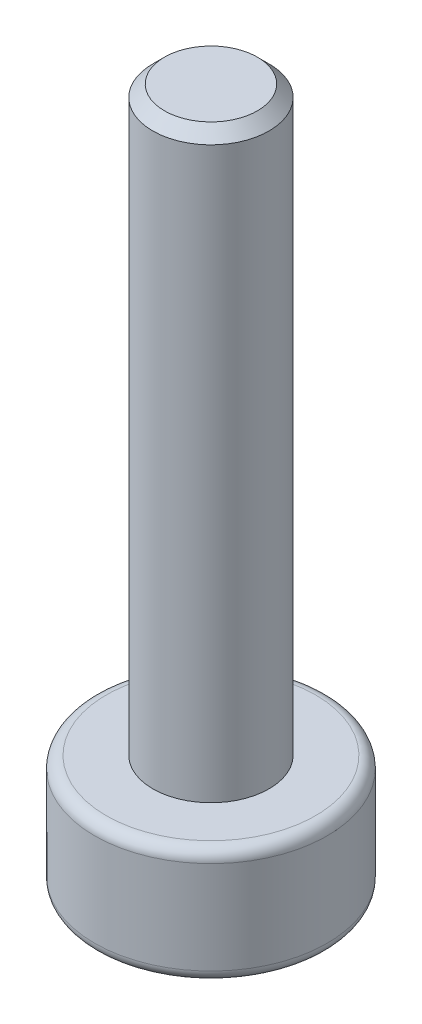
ISO-10303-21;
HEADER;
FILE_DESCRIPTION(('STEP AP214'),'2;1');
FILE_NAME('part.step','',(''),(''),'','','');
FILE_SCHEMA(('AUTOMOTIVE_DESIGN { 1 0 10303 214 1 1 1 1 }'));
ENDSEC;
DATA;
#1=APPLICATION_CONTEXT('core data for automotive mechanical design processes');
#2=APPLICATION_PROTOCOL_DEFINITION('international standard','automotive_design',2000,#1);
#3=PRODUCT_CONTEXT('',#1,'mechanical');
#4=PRODUCT('Part','Part','',(#3));
#5=PRODUCT_RELATED_PRODUCT_CATEGORY('part','',(#4));
#6=PRODUCT_DEFINITION_FORMATION('','',#4);
#7=PRODUCT_DEFINITION_CONTEXT('part definition',#1,'design');
#8=PRODUCT_DEFINITION('design','',#6,#7);
#9=PRODUCT_DEFINITION_SHAPE('','',#8);
#10=(LENGTH_UNIT() NAMED_UNIT(*) SI_UNIT(.MILLI.,.METRE.));
#11=(NAMED_UNIT(*) PLANE_ANGLE_UNIT() SI_UNIT($,.RADIAN.));
#12=(NAMED_UNIT(*) SI_UNIT($,.STERADIAN.) SOLID_ANGLE_UNIT());
#13=UNCERTAINTY_MEASURE_WITH_UNIT(LENGTH_MEASURE(1.E-05),#10,'distance_accuracy_value','');
#14=(GEOMETRIC_REPRESENTATION_CONTEXT(3) GLOBAL_UNCERTAINTY_ASSIGNED_CONTEXT((#13)) GLOBAL_UNIT_ASSIGNED_CONTEXT((#10,
#11,#12)) REPRESENTATION_CONTEXT('',''));
#15=CARTESIAN_POINT('',(0.,0.,0.));
#16=DIRECTION('',(0.,0.,1.));
#17=DIRECTION('',(1.,0.,0.));
#18=AXIS2_PLACEMENT_3D('',#15,#16,#17);
#19=CARTESIAN_POINT('',(0.,2.,0.));
#20=DIRECTION('',(0.,-1.,0.));
#21=DIRECTION('',(0.,0.,-1.));
#22=AXIS2_PLACEMENT_3D('',#19,#20,#21);
#23=CYLINDRICAL_SURFACE('',#22,2.);
#24=CARTESIAN_POINT('',(0.,0.2,0.));
#25=DIRECTION('',(0.,1.,0.));
#26=DIRECTION('',(0.,0.,1.));
#27=AXIS2_PLACEMENT_3D('',#24,#25,#26);
#28=CIRCLE('',#27,2.);
#29=CARTESIAN_POINT('',(0.,0.2,2.));
#30=VERTEX_POINT('',#29);
#31=EDGE_CURVE('E72',#30,#30,#28,.T.);
#32=ORIENTED_EDGE('',*,*,#31,.T.);
#33=EDGE_LOOP('',(#32));
#34=FACE_BOUND('',#33,.T.);
#35=CARTESIAN_POINT('',(0.,1.8,0.));
#36=DIRECTION('',(0.,1.,0.));
#37=DIRECTION('',(0.,0.,1.));
#38=AXIS2_PLACEMENT_3D('',#35,#36,#37);
#39=CIRCLE('',#38,2.);
#40=CARTESIAN_POINT('',(0.,1.8,2.));
#41=VERTEX_POINT('',#40);
#42=EDGE_CURVE('E76',#41,#41,#39,.F.);
#43=ORIENTED_EDGE('',*,*,#42,.T.);
#44=EDGE_LOOP('',(#43));
#45=FACE_BOUND('',#44,.T.);
#46=ADVANCED_FACE('F39',(#34,#45),#23,.T.);
#47=CARTESIAN_POINT('',(0.,2.,0.));
#48=DIRECTION('',(0.,1.,0.));
#49=DIRECTION('',(0.,0.,1.));
#50=AXIS2_PLACEMENT_3D('',#47,#48,#49);
#51=PLANE('',#50);
#52=CARTESIAN_POINT('',(0.,2.,0.));
#53=DIRECTION('',(0.,1.,0.));
#54=DIRECTION('',(0.,0.,1.));
#55=AXIS2_PLACEMENT_3D('',#52,#53,#54);
#56=CIRCLE('',#55,1.8);
#57=CARTESIAN_POINT('',(0.,2.,1.8));
#58=VERTEX_POINT('',#57);
#59=EDGE_CURVE('E64',#58,#58,#56,.T.);
#60=ORIENTED_EDGE('',*,*,#59,.T.);
#61=EDGE_LOOP('',(#60));
#62=FACE_BOUND('',#61,.T.);
#63=CARTESIAN_POINT('',(0.,2.,0.));
#64=DIRECTION('',(0.,1.,0.));
#65=DIRECTION('',(0.,0.,1.));
#66=AXIS2_PLACEMENT_3D('',#63,#64,#65);
#67=CIRCLE('',#66,1.);
#68=CARTESIAN_POINT('',(0.,2.,1.));
#69=VERTEX_POINT('',#68);
#70=EDGE_CURVE('E80',#69,#69,#67,.T.);
#71=ORIENTED_EDGE('',*,*,#70,.F.);
#72=EDGE_LOOP('',(#71));
#73=FACE_BOUND('',#72,.T.);
#74=ADVANCED_FACE('F107',(#62,#73),#51,.T.);
#75=CARTESIAN_POINT('',(0.,0.,0.));
#76=DIRECTION('',(0.,1.,0.));
#77=DIRECTION('',(0.,0.,1.));
#78=AXIS2_PLACEMENT_3D('',#75,#76,#77);
#79=PLANE('',#78);
#80=CARTESIAN_POINT('',(0.,0.,0.));
#81=DIRECTION('',(0.,1.,0.));
#82=DIRECTION('',(0.,0.,1.));
#83=AXIS2_PLACEMENT_3D('',#80,#81,#82);
#84=CIRCLE('',#83,0.864999999999998);
#85=CARTESIAN_POINT('',(0.,0.,0.864999999999998));
#86=VERTEX_POINT('',#85);
#87=EDGE_CURVE('E53',#86,#86,#84,.T.);
#88=ORIENTED_EDGE('',*,*,#87,.T.);
#89=EDGE_LOOP('',(#88));
#90=FACE_BOUND('',#89,.T.);
#91=CARTESIAN_POINT('',(0.,0.,0.));
#92=DIRECTION('',(0.,1.,0.));
#93=DIRECTION('',(0.,0.,1.));
#94=AXIS2_PLACEMENT_3D('',#91,#92,#93);
#95=CIRCLE('',#94,1.8);
#96=CARTESIAN_POINT('',(0.,0.,1.8));
#97=VERTEX_POINT('',#96);
#98=EDGE_CURVE('E68',#97,#97,#95,.F.);
#99=ORIENTED_EDGE('',*,*,#98,.T.);
#100=EDGE_LOOP('',(#99));
#101=FACE_BOUND('',#100,.T.);
#102=ADVANCED_FACE('F113',(#90,#101),#79,.F.);
#103=CARTESIAN_POINT('',(0.,12.,0.));
#104=DIRECTION('',(0.,-1.,0.));
#105=DIRECTION('',(0.,0.,-1.));
#106=AXIS2_PLACEMENT_3D('',#103,#104,#105);
#107=CYLINDRICAL_SURFACE('',#106,1.);
#108=CARTESIAN_POINT('',(0.,11.8,0.));
#109=DIRECTION('',(0.,1.,0.));
#110=DIRECTION('',(0.,0.,1.));
#111=AXIS2_PLACEMENT_3D('',#108,#109,#110);
#112=CIRCLE('',#111,1.);
#113=CARTESIAN_POINT('',(0.,11.8,1.));
#114=VERTEX_POINT('',#113);
#115=EDGE_CURVE('E10',#114,#114,#112,.F.);
#116=ORIENTED_EDGE('',*,*,#115,.T.);
#117=EDGE_LOOP('',(#116));
#118=FACE_BOUND('',#117,.T.);
#119=ORIENTED_EDGE('',*,*,#70,.T.);
#120=EDGE_LOOP('',(#119));
#121=FACE_BOUND('',#120,.T.);
#122=ADVANCED_FACE('F137',(#118,#121),#107,.T.);
#123=CARTESIAN_POINT('',(0.,12.,0.));
#124=DIRECTION('',(0.,1.,0.));
#125=DIRECTION('',(0.,0.,1.));
#126=AXIS2_PLACEMENT_3D('',#123,#124,#125);
#127=PLANE('',#126);
#128=CARTESIAN_POINT('',(0.,12.,0.));
#129=DIRECTION('',(0.,1.,0.));
#130=DIRECTION('',(0.,0.,1.));
#131=AXIS2_PLACEMENT_3D('',#128,#129,#130);
#132=CIRCLE('',#131,0.799999999999999);
#133=CARTESIAN_POINT('',(0.,12.,0.799999999999999));
#134=VERTEX_POINT('',#133);
#135=EDGE_CURVE('E48',#134,#134,#132,.T.);
#136=ORIENTED_EDGE('',*,*,#135,.T.);
#137=EDGE_LOOP('',(#136));
#138=FACE_BOUND('',#137,.T.);
#139=ADVANCED_FACE('F120',(#138),#127,.T.);
#140=CARTESIAN_POINT('',(0.,0.2,0.));
#141=DIRECTION('',(0.,1.,0.));
#142=DIRECTION('',(0.,0.,1.));
#143=AXIS2_PLACEMENT_3D('',#140,#141,#142);
#144=TOROIDAL_SURFACE('',#143,1.8,0.2);
#145=ORIENTED_EDGE('',*,*,#98,.F.);
#146=EDGE_LOOP('',(#145));
#147=FACE_BOUND('',#146,.T.);
#148=ORIENTED_EDGE('',*,*,#31,.F.);
#149=EDGE_LOOP('',(#148));
#150=FACE_BOUND('',#149,.T.);
#151=ADVANCED_FACE('F102',(#147,#150),#144,.T.);
#152=CARTESIAN_POINT('',(0.,1.8,0.));
#153=DIRECTION('',(0.,1.,0.));
#154=DIRECTION('',(0.,0.,1.));
#155=AXIS2_PLACEMENT_3D('',#152,#153,#154);
#156=TOROIDAL_SURFACE('',#155,1.8,0.2);
#157=ORIENTED_EDGE('',*,*,#42,.F.);
#158=EDGE_LOOP('',(#157));
#159=FACE_BOUND('',#158,.T.);
#160=ORIENTED_EDGE('',*,*,#59,.F.);
#161=EDGE_LOOP('',(#160));
#162=FACE_BOUND('',#161,.T.);
#163=ADVANCED_FACE('F93',(#159,#162),#156,.T.);
#164=CARTESIAN_POINT('',(0.,1.52,0.));
#165=DIRECTION('',(0.,-1.,0.));
#166=DIRECTION('',(0.,0.,-1.));
#167=AXIS2_PLACEMENT_3D('',#164,#165,#166);
#168=CYLINDRICAL_SURFACE('',#167,0.765);
#169=CARTESIAN_POINT('',(0.,0.0999999999999985,0.));
#170=DIRECTION('',(0.,1.,0.));
#171=DIRECTION('',(0.,0.,1.));
#172=AXIS2_PLACEMENT_3D('',#169,#170,#171);
#173=CIRCLE('',#172,0.765);
#174=CARTESIAN_POINT('',(0.,0.0999999999999985,0.765));
#175=VERTEX_POINT('',#174);
#176=EDGE_CURVE('E58',#175,#175,#173,.F.);
#177=ORIENTED_EDGE('',*,*,#176,.T.);
#178=EDGE_LOOP('',(#177));
#179=FACE_BOUND('',#178,.T.);
#180=CARTESIAN_POINT('',(0.,1.52,0.));
#181=DIRECTION('',(0.,-1.,0.));
#182=DIRECTION('',(0.,0.,-1.));
#183=AXIS2_PLACEMENT_3D('',#180,#181,#182);
#184=CIRCLE('',#183,0.765);
#185=CARTESIAN_POINT('',(0.,1.52,-0.765));
#186=VERTEX_POINT('',#185);
#187=EDGE_CURVE('E84',#186,#186,#184,.T.);
#188=ORIENTED_EDGE('',*,*,#187,.F.);
#189=EDGE_LOOP('',(#188));
#190=FACE_BOUND('',#189,.T.);
#191=ADVANCED_FACE('F91',(#179,#190),#168,.F.);
#192=CARTESIAN_POINT('',(0.,1.52,0.));
#193=DIRECTION('',(0.,-1.,0.));
#194=DIRECTION('',(0.,0.,-1.));
#195=AXIS2_PLACEMENT_3D('',#192,#193,#194);
#196=PLANE('',#195);
#197=ORIENTED_EDGE('',*,*,#187,.T.);
#198=EDGE_LOOP('',(#197));
#199=FACE_BOUND('',#198,.T.);
#200=ADVANCED_FACE('F89',(#199),#196,.T.);
#201=CARTESIAN_POINT('',(0.,0.0999999999999985,0.));
#202=DIRECTION('',(0.,-1.,0.));
#203=DIRECTION('',(0.,0.,-1.));
#204=AXIS2_PLACEMENT_3D('',#201,#202,#203);
#205=CONICAL_SURFACE('',#204,0.765,0.785398163397443);
#206=ORIENTED_EDGE('',*,*,#87,.F.);
#207=EDGE_LOOP('',(#206));
#208=FACE_BOUND('',#207,.T.);
#209=ORIENTED_EDGE('',*,*,#176,.F.);
#210=EDGE_LOOP('',(#209));
#211=FACE_BOUND('',#210,.T.);
#212=ADVANCED_FACE('F100',(#208,#211),#205,.F.);
#213=CARTESIAN_POINT('',(0.,12.,0.));
#214=DIRECTION('',(0.,-1.,0.));
#215=DIRECTION('',(0.,0.,-1.));
#216=AXIS2_PLACEMENT_3D('',#213,#214,#215);
#217=CONICAL_SURFACE('',#216,0.799999999999999,0.785398163397446);
#218=ORIENTED_EDGE('',*,*,#115,.F.);
#219=EDGE_LOOP('',(#218));
#220=FACE_BOUND('',#219,.T.);
#221=ORIENTED_EDGE('',*,*,#135,.F.);
#222=EDGE_LOOP('',(#221));
#223=FACE_BOUND('',#222,.T.);
#224=ADVANCED_FACE('F42',(#220,#223),#217,.T.);
#225=CLOSED_SHELL('',(#46,#74,#102,#122,#139,#151,#163,#191,#200,#212,#224));
#226=MANIFOLD_SOLID_BREP('B2',#225);
#227=ADVANCED_BREP_SHAPE_REPRESENTATION('',(#18,#226),#14);
#228=SHAPE_DEFINITION_REPRESENTATION(#9,#227);
ENDSEC;
END-ISO-10303-21;
